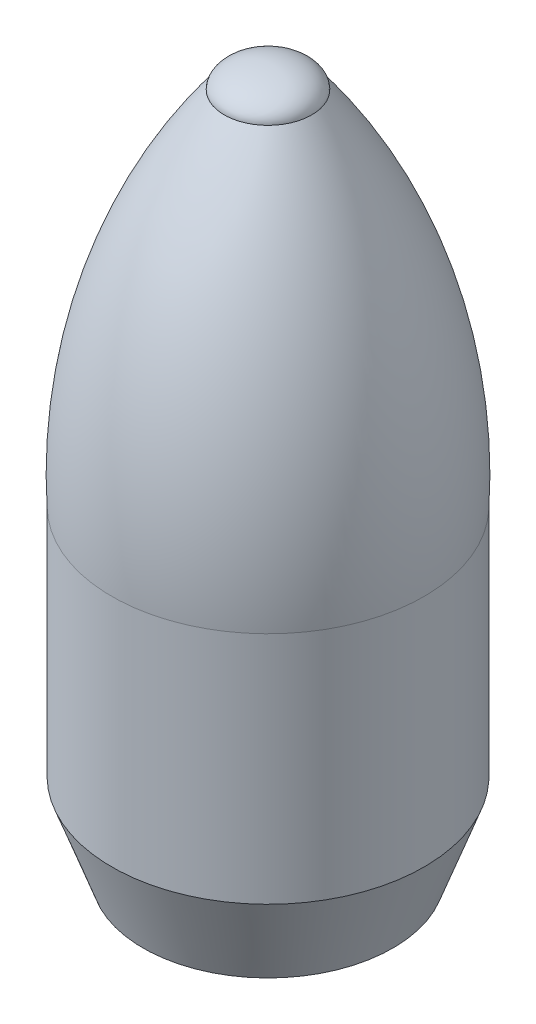
ISO-10303-21;
HEADER;
FILE_DESCRIPTION(('STEP AP214'),'2;1');
FILE_NAME('part.step','',(''),(''),'','','');
FILE_SCHEMA(('AUTOMOTIVE_DESIGN { 1 0 10303 214 1 1 1 1 }'));
ENDSEC;
DATA;
#1=APPLICATION_CONTEXT('core data for automotive mechanical design processes');
#2=APPLICATION_PROTOCOL_DEFINITION('international standard','automotive_design',2000,#1);
#3=PRODUCT_CONTEXT('',#1,'mechanical');
#4=PRODUCT('Part','Part','',(#3));
#5=PRODUCT_RELATED_PRODUCT_CATEGORY('part','',(#4));
#6=PRODUCT_DEFINITION_FORMATION('','',#4);
#7=PRODUCT_DEFINITION_CONTEXT('part definition',#1,'design');
#8=PRODUCT_DEFINITION('design','',#6,#7);
#9=PRODUCT_DEFINITION_SHAPE('','',#8);
#10=(LENGTH_UNIT() NAMED_UNIT(*) SI_UNIT(.MILLI.,.METRE.));
#11=(NAMED_UNIT(*) PLANE_ANGLE_UNIT() SI_UNIT($,.RADIAN.));
#12=(NAMED_UNIT(*) SI_UNIT($,.STERADIAN.) SOLID_ANGLE_UNIT());
#13=UNCERTAINTY_MEASURE_WITH_UNIT(LENGTH_MEASURE(1.E-05),#10,'distance_accuracy_value','');
#14=(GEOMETRIC_REPRESENTATION_CONTEXT(3) GLOBAL_UNCERTAINTY_ASSIGNED_CONTEXT((#13)) GLOBAL_UNIT_ASSIGNED_CONTEXT((#10,
#11,#12)) REPRESENTATION_CONTEXT('',''));
#15=CARTESIAN_POINT('',(0.,0.,0.));
#16=DIRECTION('',(0.,0.,1.));
#17=DIRECTION('',(1.,0.,0.));
#18=AXIS2_PLACEMENT_3D('',#15,#16,#17);
#19=CARTESIAN_POINT('',(0.,10900.,0.));
#20=DIRECTION('',(-1.,0.,0.));
#21=DIRECTION('',(0.,0.,-1.));
#22=AXIS2_PLACEMENT_3D('',#19,#20,#21);
#23=ELLIPSE('',#22,699.999999999997,350.000000000001);
#24=TRIMMED_CURVE('',#23,(PARAMETER_VALUE(4.71238898038469)),
(PARAMETER_VALUE(7.85398163397448)),.T.,.PARAMETER.);
#25=CARTESIAN_POINT('',(0.,10550.,0.));
#26=DIRECTION('',(0.,1.,0.));
#27=AXIS1_PLACEMENT('',#25,#26);
#28=SURFACE_OF_REVOLUTION('',#24,#27);
#29=CARTESIAN_POINT('',(0.,11250.,1.28587913910472E-13));
#30=VERTEX_POINT('',#29);
#31=VERTEX_LOOP('',#30);
#32=FACE_BOUND('',#31,.T.);
#33=CARTESIAN_POINT('',(0.,10900.,0.));
#34=DIRECTION('',(0.,-1.,0.));
#35=DIRECTION('',(0.,0.,-1.));
#36=AXIS2_PLACEMENT_3D('',#33,#34,#35);
#37=CIRCLE('',#36,699.999999999997);
#38=CARTESIAN_POINT('',(0.,10900.,-699.999999999997));
#39=VERTEX_POINT('',#38);
#40=EDGE_CURVE('E11',#39,#39,#37,.T.);
#41=ORIENTED_EDGE('',*,*,#40,.F.);
#42=EDGE_LOOP('',(#41));
#43=FACE_BOUND('',#42,.T.);
#44=ADVANCED_FACE('F39',(#32,#43),#28,.F.);
#45=CARTESIAN_POINT('',(0.,5569.68278534351,0.));
#46=DIRECTION('',(0.,-1.,0.));
#47=DIRECTION('',(0.,0.,-1.));
#48=AXIS2_PLACEMENT_3D('',#45,#46,#47);
#49=DEGENERATE_TOROIDAL_SURFACE('',#48,6237.37189702289,8748.68049745024,.F.);
#50=ORIENTED_EDGE('',*,*,#40,.T.);
#51=EDGE_LOOP('',(#50));
#52=FACE_BOUND('',#51,.T.);
#53=CARTESIAN_POINT('',(0.,5125.,0.));
#54=DIRECTION('',(0.,-1.,0.));
#55=DIRECTION('',(0.,0.,-1.));
#56=AXIS2_PLACEMENT_3D('',#53,#54,#55);
#57=CIRCLE('',#56,2500.);
#58=CARTESIAN_POINT('',(0.,5125.,-2500.));
#59=VERTEX_POINT('',#58);
#60=EDGE_CURVE('E46',#59,#59,#57,.T.);
#61=ORIENTED_EDGE('',*,*,#60,.F.);
#62=EDGE_LOOP('',(#61));
#63=FACE_BOUND('',#62,.T.);
#64=ADVANCED_FACE('F51',(#52,#63),#49,.F.);
#65=CARTESIAN_POINT('',(0.,-1.04717446366374E-12,0.));
#66=DIRECTION('',(0.,-1.,0.));
#67=DIRECTION('',(0.,0.,-1.));
#68=AXIS2_PLACEMENT_3D('',#65,#66,#67);
#69=CYLINDRICAL_SURFACE('',#68,2500.);
#70=ORIENTED_EDGE('',*,*,#60,.T.);
#71=EDGE_LOOP('',(#70));
#72=FACE_BOUND('',#71,.T.);
#73=CARTESIAN_POINT('',(0.,1375.,0.));
#74=DIRECTION('',(0.,-1.,0.));
#75=DIRECTION('',(0.,0.,-1.));
#76=AXIS2_PLACEMENT_3D('',#73,#74,#75);
#77=CIRCLE('',#76,2500.);
#78=CARTESIAN_POINT('',(0.,1375.,-2500.));
#79=VERTEX_POINT('',#78);
#80=EDGE_CURVE('E58',#79,#79,#77,.T.);
#81=ORIENTED_EDGE('',*,*,#80,.F.);
#82=EDGE_LOOP('',(#81));
#83=FACE_BOUND('',#82,.T.);
#84=ADVANCED_FACE('F57',(#72,#83),#69,.T.);
#85=CARTESIAN_POINT('',(0.,-1.04717446366374E-12,0.));
#86=DIRECTION('',(0.,1.,0.));
#87=DIRECTION('',(0.,0.,1.));
#88=AXIS2_PLACEMENT_3D('',#85,#86,#87);
#89=CONICAL_SURFACE('',#88,2000.,0.348771003583907);
#90=ORIENTED_EDGE('',*,*,#80,.T.);
#91=EDGE_LOOP('',(#90));
#92=FACE_BOUND('',#91,.T.);
#93=CARTESIAN_POINT('',(0.,-1.04717446366374E-12,0.));
#94=DIRECTION('',(0.,-1.,0.));
#95=DIRECTION('',(0.,0.,-1.));
#96=AXIS2_PLACEMENT_3D('',#93,#94,#95);
#97=CIRCLE('',#96,2000.);
#98=CARTESIAN_POINT('',(0.,-1.04717446366374E-12,-2000.));
#99=VERTEX_POINT('',#98);
#100=EDGE_CURVE('E64',#99,#99,#97,.T.);
#101=ORIENTED_EDGE('',*,*,#100,.F.);
#102=EDGE_LOOP('',(#101));
#103=FACE_BOUND('',#102,.T.);
#104=ADVANCED_FACE('F72',(#92,#103),#89,.T.);
#105=CARTESIAN_POINT('',(0.,-1.04717446366374E-12,0.));
#106=DIRECTION('',(0.,-1.,0.));
#107=DIRECTION('',(0.,0.,-1.));
#108=AXIS2_PLACEMENT_3D('',#105,#106,#107);
#109=PLANE('',#108);
#110=ORIENTED_EDGE('',*,*,#100,.T.);
#111=EDGE_LOOP('',(#110));
#112=FACE_BOUND('',#111,.T.);
#113=ADVANCED_FACE('F69',(#112),#109,.T.);
#114=CLOSED_SHELL('',(#44,#64,#84,#104,#113));
#115=MANIFOLD_SOLID_BREP('B2',#114);
#116=ADVANCED_BREP_SHAPE_REPRESENTATION('',(#18,#115),#14);
#117=SHAPE_DEFINITION_REPRESENTATION(#9,#116);
ENDSEC;
END-ISO-10303-21;
